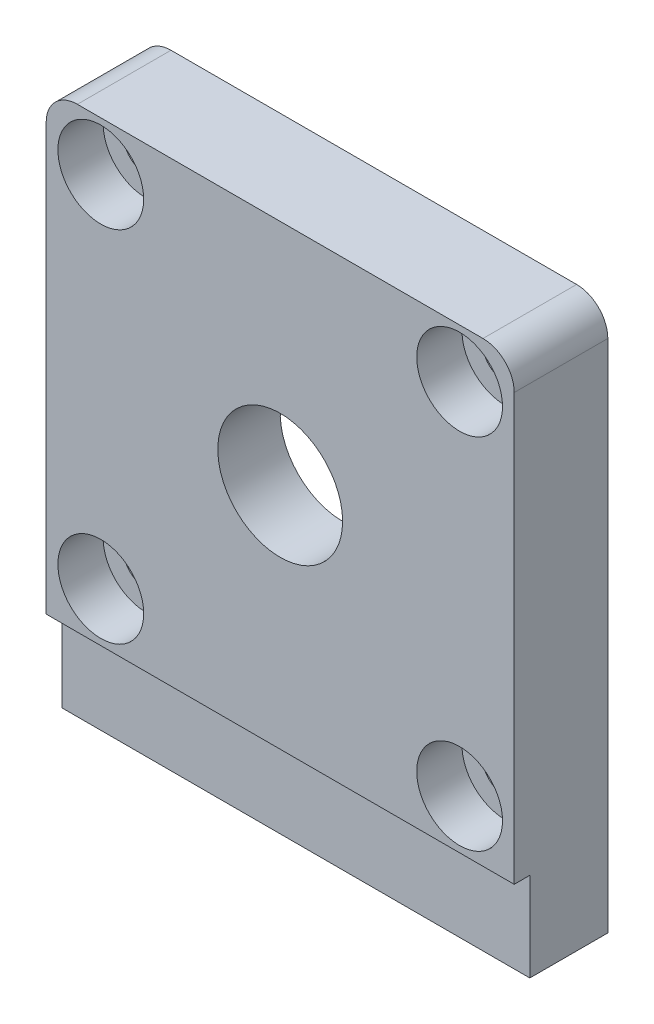
ISO-10303-21;
HEADER;
FILE_DESCRIPTION(('STEP AP214'),'2;1');
FILE_NAME('part.step','',(''),(''),'','','');
FILE_SCHEMA(('AUTOMOTIVE_DESIGN { 1 0 10303 214 1 1 1 1 }'));
ENDSEC;
DATA;
#1=APPLICATION_CONTEXT('core data for automotive mechanical design processes');
#2=APPLICATION_PROTOCOL_DEFINITION('international standard','automotive_design',2000,#1);
#3=PRODUCT_CONTEXT('',#1,'mechanical');
#4=PRODUCT('Part','Part','',(#3));
#5=PRODUCT_RELATED_PRODUCT_CATEGORY('part','',(#4));
#6=PRODUCT_DEFINITION_FORMATION('','',#4);
#7=PRODUCT_DEFINITION_CONTEXT('part definition',#1,'design');
#8=PRODUCT_DEFINITION('design','',#6,#7);
#9=PRODUCT_DEFINITION_SHAPE('','',#8);
#10=(LENGTH_UNIT() NAMED_UNIT(*) SI_UNIT(.MILLI.,.METRE.));
#11=(NAMED_UNIT(*) PLANE_ANGLE_UNIT() SI_UNIT($,.RADIAN.));
#12=(NAMED_UNIT(*) SI_UNIT($,.STERADIAN.) SOLID_ANGLE_UNIT());
#13=UNCERTAINTY_MEASURE_WITH_UNIT(LENGTH_MEASURE(1.E-05),#10,'distance_accuracy_value','');
#14=(GEOMETRIC_REPRESENTATION_CONTEXT(3) GLOBAL_UNCERTAINTY_ASSIGNED_CONTEXT((#13)) GLOBAL_UNIT_ASSIGNED_CONTEXT((#10,
#11,#12)) REPRESENTATION_CONTEXT('',''));
#15=CARTESIAN_POINT('',(0.,0.,0.));
#16=DIRECTION('',(0.,0.,1.));
#17=DIRECTION('',(1.,0.,0.));
#18=AXIS2_PLACEMENT_3D('',#15,#16,#17);
#19=CARTESIAN_POINT('',(0.,17.35,-16.3137084989848));
#20=DIRECTION('',(0.,0.,1.));
#21=DIRECTION('',(1.,0.,0.));
#22=AXIS2_PLACEMENT_3D('',#19,#20,#21);
#23=CYLINDRICAL_SURFACE('',#22,4.);
#24=CARTESIAN_POINT('',(0.,17.35,1.));
#25=DIRECTION('',(0.,0.,1.));
#26=DIRECTION('',(1.,0.,0.));
#27=AXIS2_PLACEMENT_3D('',#24,#25,#26);
#28=CIRCLE('',#27,4.);
#29=CARTESIAN_POINT('',(4.,17.35,1.));
#30=VERTEX_POINT('',#29);
#31=EDGE_CURVE('E164',#30,#30,#28,.T.);
#32=ORIENTED_EDGE('',*,*,#31,.T.);
#33=EDGE_LOOP('',(#32));
#34=FACE_BOUND('',#33,.T.);
#35=CARTESIAN_POINT('',(0.,17.35,-3.));
#36=DIRECTION('',(0.,0.,-1.));
#37=DIRECTION('',(0.,1.,0.));
#38=AXIS2_PLACEMENT_3D('',#35,#36,#37);
#39=CIRCLE('',#38,4.);
#40=CARTESIAN_POINT('',(0.,21.35,-3.));
#41=VERTEX_POINT('',#40);
#42=EDGE_CURVE('E162',#41,#41,#39,.F.);
#43=ORIENTED_EDGE('',*,*,#42,.F.);
#44=EDGE_LOOP('',(#43));
#45=FACE_BOUND('',#44,.T.);
#46=ADVANCED_FACE('F44',(#34,#45),#23,.F.);
#47=CARTESIAN_POINT('',(50.5105618091294,2.7,0.));
#48=DIRECTION('',(0.,-1.,0.));
#49=DIRECTION('',(0.,0.,-1.));
#50=AXIS2_PLACEMENT_3D('',#47,#48,#49);
#51=PLANE('',#50);
#52=DIRECTION('',(0.,0.,-1.));
#53=VECTOR('',#52,1.);
#54=CARTESIAN_POINT('',(15.,2.7,0.));
#55=LINE('',#54,#53);
#56=CARTESIAN_POINT('',(15.,2.7,1.));
#57=VERTEX_POINT('',#56);
#58=CARTESIAN_POINT('',(15.,2.7,0.));
#59=VERTEX_POINT('',#58);
#60=EDGE_CURVE('E117',#57,#59,#55,.T.);
#61=ORIENTED_EDGE('',*,*,#60,.F.);
#62=DIRECTION('',(-1.,0.,0.));
#63=VECTOR('',#62,1.);
#64=CARTESIAN_POINT('',(50.5105618091294,2.7,1.));
#65=LINE('',#64,#63);
#66=CARTESIAN_POINT('',(-15.,2.7,1.));
#67=VERTEX_POINT('',#66);
#68=EDGE_CURVE('E111',#57,#67,#65,.T.);
#69=ORIENTED_EDGE('',*,*,#68,.T.);
#70=DIRECTION('',(0.,0.,1.));
#71=VECTOR('',#70,1.);
#72=CARTESIAN_POINT('',(-15.,2.7,0.));
#73=LINE('',#72,#71);
#74=CARTESIAN_POINT('',(-15.,2.7,0.));
#75=VERTEX_POINT('',#74);
#76=EDGE_CURVE('E116',#75,#67,#73,.T.);
#77=ORIENTED_EDGE('',*,*,#76,.F.);
#78=DIRECTION('',(-1.,0.,0.));
#79=VECTOR('',#78,1.);
#80=CARTESIAN_POINT('',(50.5105618091294,2.7,0.));
#81=LINE('',#80,#79);
#82=EDGE_CURVE('E150',#59,#75,#81,.T.);
#83=ORIENTED_EDGE('',*,*,#82,.F.);
#84=EDGE_LOOP('',(#61,#69,#77,#83));
#85=FACE_BOUND('',#84,.T.);
#86=ADVANCED_FACE('F113',(#85),#51,.T.);
#87=CARTESIAN_POINT('',(50.5105618091294,2.7,0.));
#88=DIRECTION('',(0.,0.,1.));
#89=DIRECTION('',(1.,0.,0.));
#90=AXIS2_PLACEMENT_3D('',#87,#88,#89);
#91=PLANE('',#90);
#92=DIRECTION('',(0.,-1.,0.));
#93=VECTOR('',#92,1.);
#94=CARTESIAN_POINT('',(15.,2.7,0.));
#95=LINE('',#94,#93);
#96=CARTESIAN_POINT('',(15.,-3.,0.));
#97=VERTEX_POINT('',#96);
#98=EDGE_CURVE('E200',#59,#97,#95,.T.);
#99=ORIENTED_EDGE('',*,*,#98,.F.);
#100=ORIENTED_EDGE('',*,*,#82,.T.);
#101=DIRECTION('',(0.,1.,0.));
#102=VECTOR('',#101,1.);
#103=CARTESIAN_POINT('',(-15.,2.7,0.));
#104=LINE('',#103,#102);
#105=CARTESIAN_POINT('',(-15.,-3.,0.));
#106=VERTEX_POINT('',#105);
#107=EDGE_CURVE('E125',#106,#75,#104,.T.);
#108=ORIENTED_EDGE('',*,*,#107,.F.);
#109=DIRECTION('',(-1.,0.,0.));
#110=VECTOR('',#109,1.);
#111=CARTESIAN_POINT('',(50.5105618091294,-3.,0.));
#112=LINE('',#111,#110);
#113=EDGE_CURVE('E151',#97,#106,#112,.T.);
#114=ORIENTED_EDGE('',*,*,#113,.F.);
#115=EDGE_LOOP('',(#99,#100,#108,#114));
#116=FACE_BOUND('',#115,.T.);
#117=ADVANCED_FACE('F198',(#116),#91,.T.);
#118=CARTESIAN_POINT('',(50.5105618091294,-3.,-5.));
#119=DIRECTION('',(0.,-1.,0.));
#120=DIRECTION('',(0.,0.,-1.));
#121=AXIS2_PLACEMENT_3D('',#118,#119,#120);
#122=PLANE('',#121);
#123=DIRECTION('',(0.,0.,-1.));
#124=VECTOR('',#123,1.);
#125=CARTESIAN_POINT('',(15.,-3.,-5.));
#126=LINE('',#125,#124);
#127=CARTESIAN_POINT('',(15.,-3.,-5.));
#128=VERTEX_POINT('',#127);
#129=EDGE_CURVE('E190',#97,#128,#126,.T.);
#130=ORIENTED_EDGE('',*,*,#129,.F.);
#131=ORIENTED_EDGE('',*,*,#113,.T.);
#132=DIRECTION('',(0.,0.,1.));
#133=VECTOR('',#132,1.);
#134=CARTESIAN_POINT('',(-15.,-3.,-5.));
#135=LINE('',#134,#133);
#136=CARTESIAN_POINT('',(-15.,-3.,-5.));
#137=VERTEX_POINT('',#136);
#138=EDGE_CURVE('E143',#137,#106,#135,.T.);
#139=ORIENTED_EDGE('',*,*,#138,.F.);
#140=DIRECTION('',(-1.,0.,0.));
#141=VECTOR('',#140,1.);
#142=CARTESIAN_POINT('',(50.5105618091294,-3.,-5.));
#143=LINE('',#142,#141);
#144=EDGE_CURVE('E154',#128,#137,#143,.T.);
#145=ORIENTED_EDGE('',*,*,#144,.F.);
#146=EDGE_LOOP('',(#130,#131,#139,#145));
#147=FACE_BOUND('',#146,.T.);
#148=ADVANCED_FACE('F193',(#147),#122,.T.);
#149=CARTESIAN_POINT('',(50.5105618091294,32.,-5.));
#150=DIRECTION('',(0.,0.,-1.));
#151=DIRECTION('',(0.,1.,0.));
#152=AXIS2_PLACEMENT_3D('',#149,#150,#151);
#153=PLANE('',#152);
#154=CARTESIAN_POINT('',(0.,17.35,-5.));
#155=DIRECTION('',(0.,0.,-1.));
#156=DIRECTION('',(0.,1.,0.));
#157=AXIS2_PLACEMENT_3D('',#154,#155,#156);
#158=CIRCLE('',#157,11.);
#159=CARTESIAN_POINT('',(0.,28.35,-5.));
#160=VERTEX_POINT('',#159);
#161=EDGE_CURVE('E248',#160,#160,#158,.T.);
#162=ORIENTED_EDGE('',*,*,#161,.F.);
#163=EDGE_LOOP('',(#162));
#164=FACE_BOUND('',#163,.T.);
#165=CARTESIAN_POINT('',(-11.5,28.85,-5.));
#166=DIRECTION('',(0.,0.,-1.));
#167=DIRECTION('',(0.,1.,0.));
#168=AXIS2_PLACEMENT_3D('',#165,#166,#167);
#169=CIRCLE('',#168,1.45);
#170=CARTESIAN_POINT('',(-11.5,30.3,-5.));
#171=VERTEX_POINT('',#170);
#172=EDGE_CURVE('E236',#171,#171,#169,.F.);
#173=ORIENTED_EDGE('',*,*,#172,.T.);
#174=EDGE_LOOP('',(#173));
#175=FACE_BOUND('',#174,.T.);
#176=CARTESIAN_POINT('',(11.5,28.85,-5.));
#177=DIRECTION('',(0.,0.,-1.));
#178=DIRECTION('',(0.,1.,0.));
#179=AXIS2_PLACEMENT_3D('',#176,#177,#178);
#180=CIRCLE('',#179,1.45);
#181=CARTESIAN_POINT('',(11.5,30.3,-5.));
#182=VERTEX_POINT('',#181);
#183=EDGE_CURVE('E221',#182,#182,#180,.F.);
#184=ORIENTED_EDGE('',*,*,#183,.T.);
#185=EDGE_LOOP('',(#184));
#186=FACE_BOUND('',#185,.T.);
#187=CARTESIAN_POINT('',(11.5,5.85,-5.));
#188=DIRECTION('',(0.,0.,-1.));
#189=DIRECTION('',(0.,1.,0.));
#190=AXIS2_PLACEMENT_3D('',#187,#188,#189);
#191=CIRCLE('',#190,1.45);
#192=CARTESIAN_POINT('',(11.5,7.3,-5.));
#193=VERTEX_POINT('',#192);
#194=EDGE_CURVE('E214',#193,#193,#191,.F.);
#195=ORIENTED_EDGE('',*,*,#194,.T.);
#196=EDGE_LOOP('',(#195));
#197=FACE_BOUND('',#196,.T.);
#198=CARTESIAN_POINT('',(-11.5,5.85,-5.));
#199=DIRECTION('',(0.,0.,-1.));
#200=DIRECTION('',(0.,1.,0.));
#201=AXIS2_PLACEMENT_3D('',#198,#199,#200);
#202=CIRCLE('',#201,1.45);
#203=CARTESIAN_POINT('',(-11.5,7.3,-5.));
#204=VERTEX_POINT('',#203);
#205=EDGE_CURVE('E205',#204,#204,#202,.F.);
#206=ORIENTED_EDGE('',*,*,#205,.T.);
#207=EDGE_LOOP('',(#206));
#208=FACE_BOUND('',#207,.T.);
#209=DIRECTION('',(-1.,0.,0.));
#210=VECTOR('',#209,1.);
#211=CARTESIAN_POINT('',(50.5105618091294,32.,-5.));
#212=LINE('',#211,#210);
#213=CARTESIAN_POINT('',(13.,32.,-5.));
#214=VERTEX_POINT('',#213);
#215=CARTESIAN_POINT('',(-13.,32.,-5.));
#216=VERTEX_POINT('',#215);
#217=EDGE_CURVE('E157',#214,#216,#212,.T.);
#218=ORIENTED_EDGE('',*,*,#217,.F.);
#219=CARTESIAN_POINT('',(13.,30.,-5.));
#220=DIRECTION('',(0.,0.,-1.));
#221=DIRECTION('',(0.,1.,0.));
#222=AXIS2_PLACEMENT_3D('',#219,#220,#221);
#223=CIRCLE('',#222,2.);
#224=CARTESIAN_POINT('',(15.,30.,-5.));
#225=VERTEX_POINT('',#224);
#226=EDGE_CURVE('E52',#214,#225,#223,.T.);
#227=ORIENTED_EDGE('',*,*,#226,.T.);
#228=DIRECTION('',(0.,1.,0.));
#229=VECTOR('',#228,1.);
#230=CARTESIAN_POINT('',(15.,32.,-5.));
#231=LINE('',#230,#229);
#232=EDGE_CURVE('E148',#128,#225,#231,.T.);
#233=ORIENTED_EDGE('',*,*,#232,.F.);
#234=ORIENTED_EDGE('',*,*,#144,.T.);
#235=DIRECTION('',(0.,-1.,0.));
#236=VECTOR('',#235,1.);
#237=CARTESIAN_POINT('',(-15.,32.,-5.));
#238=LINE('',#237,#236);
#239=CARTESIAN_POINT('',(-15.,30.,-5.));
#240=VERTEX_POINT('',#239);
#241=EDGE_CURVE('E131',#240,#137,#238,.T.);
#242=ORIENTED_EDGE('',*,*,#241,.F.);
#243=CARTESIAN_POINT('',(-13.,30.,-5.));
#244=DIRECTION('',(0.,0.,-1.));
#245=DIRECTION('',(0.,1.,0.));
#246=AXIS2_PLACEMENT_3D('',#243,#244,#245);
#247=CIRCLE('',#246,2.);
#248=EDGE_CURVE('E58',#240,#216,#247,.T.);
#249=ORIENTED_EDGE('',*,*,#248,.T.);
#250=EDGE_LOOP('',(#218,#227,#233,#234,#242,#249));
#251=FACE_BOUND('',#250,.T.);
#252=ADVANCED_FACE('F177',(#164,#175,#186,#197,#208,#251),#153,.T.);
#253=CARTESIAN_POINT('',(50.5105618091294,32.,1.));
#254=DIRECTION('',(0.,1.,0.));
#255=DIRECTION('',(0.,0.,1.));
#256=AXIS2_PLACEMENT_3D('',#253,#254,#255);
#257=PLANE('',#256);
#258=DIRECTION('',(-1.,0.,0.));
#259=VECTOR('',#258,1.);
#260=CARTESIAN_POINT('',(50.5105618091294,32.,1.));
#261=LINE('',#260,#259);
#262=CARTESIAN_POINT('',(13.,32.,1.));
#263=VERTEX_POINT('',#262);
#264=CARTESIAN_POINT('',(-13.,32.,1.));
#265=VERTEX_POINT('',#264);
#266=EDGE_CURVE('E122',#263,#265,#261,.T.);
#267=ORIENTED_EDGE('',*,*,#266,.F.);
#268=DIRECTION('',(0.,0.,1.));
#269=VECTOR('',#268,1.);
#270=CARTESIAN_POINT('',(13.,32.,-5.));
#271=LINE('',#270,#269);
#272=EDGE_CURVE('E172',#263,#214,#271,.F.);
#273=ORIENTED_EDGE('',*,*,#272,.T.);
#274=ORIENTED_EDGE('',*,*,#217,.T.);
#275=DIRECTION('',(0.,0.,-1.));
#276=VECTOR('',#275,1.);
#277=CARTESIAN_POINT('',(-13.,32.,1.));
#278=LINE('',#277,#276);
#279=EDGE_CURVE('E175',#216,#265,#278,.F.);
#280=ORIENTED_EDGE('',*,*,#279,.T.);
#281=EDGE_LOOP('',(#267,#273,#274,#280));
#282=FACE_BOUND('',#281,.T.);
#283=ADVANCED_FACE('F194',(#282),#257,.T.);
#284=CARTESIAN_POINT('',(50.5105618091294,2.7,1.));
#285=DIRECTION('',(0.,0.,1.));
#286=DIRECTION('',(1.,0.,0.));
#287=AXIS2_PLACEMENT_3D('',#284,#285,#286);
#288=PLANE('',#287);
#289=ORIENTED_EDGE('',*,*,#31,.F.);
#290=EDGE_LOOP('',(#289));
#291=FACE_BOUND('',#290,.T.);
#292=CARTESIAN_POINT('',(-11.5,28.85,1.));
#293=DIRECTION('',(0.,0.,1.));
#294=DIRECTION('',(1.,0.,0.));
#295=AXIS2_PLACEMENT_3D('',#292,#293,#294);
#296=CIRCLE('',#295,2.75);
#297=CARTESIAN_POINT('',(-8.75,28.85,1.));
#298=VERTEX_POINT('',#297);
#299=EDGE_CURVE('E239',#298,#298,#296,.T.);
#300=ORIENTED_EDGE('',*,*,#299,.F.);
#301=EDGE_LOOP('',(#300));
#302=FACE_BOUND('',#301,.T.);
#303=CARTESIAN_POINT('',(11.5,28.85,1.));
#304=DIRECTION('',(0.,0.,1.));
#305=DIRECTION('',(1.,0.,0.));
#306=AXIS2_PLACEMENT_3D('',#303,#304,#305);
#307=CIRCLE('',#306,2.75);
#308=CARTESIAN_POINT('',(14.25,28.85,1.));
#309=VERTEX_POINT('',#308);
#310=EDGE_CURVE('E226',#309,#309,#307,.T.);
#311=ORIENTED_EDGE('',*,*,#310,.F.);
#312=EDGE_LOOP('',(#311));
#313=FACE_BOUND('',#312,.T.);
#314=CARTESIAN_POINT('',(11.5,5.85,1.));
#315=DIRECTION('',(0.,0.,1.));
#316=DIRECTION('',(1.,0.,0.));
#317=AXIS2_PLACEMENT_3D('',#314,#315,#316);
#318=CIRCLE('',#317,2.75);
#319=CARTESIAN_POINT('',(14.25,5.85,1.));
#320=VERTEX_POINT('',#319);
#321=EDGE_CURVE('E216',#320,#320,#318,.T.);
#322=ORIENTED_EDGE('',*,*,#321,.F.);
#323=EDGE_LOOP('',(#322));
#324=FACE_BOUND('',#323,.T.);
#325=CARTESIAN_POINT('',(-11.5,5.85,1.));
#326=DIRECTION('',(0.,0.,1.));
#327=DIRECTION('',(1.,0.,0.));
#328=AXIS2_PLACEMENT_3D('',#325,#326,#327);
#329=CIRCLE('',#328,2.75);
#330=CARTESIAN_POINT('',(-8.75,5.85,1.));
#331=VERTEX_POINT('',#330);
#332=EDGE_CURVE('E207',#331,#331,#329,.T.);
#333=ORIENTED_EDGE('',*,*,#332,.F.);
#334=EDGE_LOOP('',(#333));
#335=FACE_BOUND('',#334,.T.);
#336=DIRECTION('',(0.,-1.,0.));
#337=VECTOR('',#336,1.);
#338=CARTESIAN_POINT('',(15.,2.7,1.));
#339=LINE('',#338,#337);
#340=CARTESIAN_POINT('',(15.,30.,1.));
#341=VERTEX_POINT('',#340);
#342=EDGE_CURVE('E156',#341,#57,#339,.T.);
#343=ORIENTED_EDGE('',*,*,#342,.F.);
#344=CARTESIAN_POINT('',(13.,30.,1.));
#345=DIRECTION('',(0.,0.,1.));
#346=DIRECTION('',(1.,0.,0.));
#347=AXIS2_PLACEMENT_3D('',#344,#345,#346);
#348=CIRCLE('',#347,2.);
#349=EDGE_CURVE('E167',#341,#263,#348,.T.);
#350=ORIENTED_EDGE('',*,*,#349,.T.);
#351=ORIENTED_EDGE('',*,*,#266,.T.);
#352=CARTESIAN_POINT('',(-13.,30.,1.));
#353=DIRECTION('',(0.,0.,1.));
#354=DIRECTION('',(1.,0.,0.));
#355=AXIS2_PLACEMENT_3D('',#352,#353,#354);
#356=CIRCLE('',#355,2.);
#357=CARTESIAN_POINT('',(-15.,30.,1.));
#358=VERTEX_POINT('',#357);
#359=EDGE_CURVE('E126',#265,#358,#356,.T.);
#360=ORIENTED_EDGE('',*,*,#359,.T.);
#361=DIRECTION('',(0.,1.,0.));
#362=VECTOR('',#361,1.);
#363=CARTESIAN_POINT('',(-15.,2.7,1.));
#364=LINE('',#363,#362);
#365=EDGE_CURVE('E123',#67,#358,#364,.T.);
#366=ORIENTED_EDGE('',*,*,#365,.F.);
#367=ORIENTED_EDGE('',*,*,#68,.F.);
#368=EDGE_LOOP('',(#343,#350,#351,#360,#366,#367));
#369=FACE_BOUND('',#368,.T.);
#370=ADVANCED_FACE('F127',(#291,#302,#313,#324,#335,#369),#288,.T.);
#371=CARTESIAN_POINT('',(-15.,0.,0.));
#372=DIRECTION('',(-1.,0.,0.));
#373=DIRECTION('',(0.,0.,1.));
#374=AXIS2_PLACEMENT_3D('',#371,#372,#373);
#375=PLANE('',#374);
#376=ORIENTED_EDGE('',*,*,#365,.T.);
#377=DIRECTION('',(0.,0.,-1.));
#378=VECTOR('',#377,1.);
#379=CARTESIAN_POINT('',(-15.,30.,0.));
#380=LINE('',#379,#378);
#381=EDGE_CURVE('E11',#358,#240,#380,.T.);
#382=ORIENTED_EDGE('',*,*,#381,.T.);
#383=ORIENTED_EDGE('',*,*,#241,.T.);
#384=ORIENTED_EDGE('',*,*,#138,.T.);
#385=ORIENTED_EDGE('',*,*,#107,.T.);
#386=ORIENTED_EDGE('',*,*,#76,.T.);
#387=EDGE_LOOP('',(#376,#382,#383,#384,#385,#386));
#388=FACE_BOUND('',#387,.T.);
#389=ADVANCED_FACE('F134',(#388),#375,.T.);
#390=CARTESIAN_POINT('',(15.,-3.,138.));
#391=DIRECTION('',(-1.,0.,0.));
#392=DIRECTION('',(0.,0.,1.));
#393=AXIS2_PLACEMENT_3D('',#390,#391,#392);
#394=PLANE('',#393);
#395=ORIENTED_EDGE('',*,*,#232,.T.);
#396=DIRECTION('',(0.,0.,1.));
#397=VECTOR('',#396,1.);
#398=CARTESIAN_POINT('',(15.,30.,1.));
#399=LINE('',#398,#397);
#400=EDGE_CURVE('E163',#225,#341,#399,.T.);
#401=ORIENTED_EDGE('',*,*,#400,.T.);
#402=ORIENTED_EDGE('',*,*,#342,.T.);
#403=ORIENTED_EDGE('',*,*,#60,.T.);
#404=ORIENTED_EDGE('',*,*,#98,.T.);
#405=ORIENTED_EDGE('',*,*,#129,.T.);
#406=EDGE_LOOP('',(#395,#401,#402,#403,#404,#405));
#407=FACE_BOUND('',#406,.T.);
#408=ADVANCED_FACE('F184',(#407),#394,.F.);
#409=CARTESIAN_POINT('',(-11.5,5.85,1.));
#410=DIRECTION('',(0.,0.,1.));
#411=DIRECTION('',(1.,0.,0.));
#412=AXIS2_PLACEMENT_3D('',#409,#410,#411);
#413=CYLINDRICAL_SURFACE('',#412,1.45);
#414=ORIENTED_EDGE('',*,*,#205,.F.);
#415=EDGE_LOOP('',(#414));
#416=FACE_BOUND('',#415,.T.);
#417=CARTESIAN_POINT('',(-11.5,5.85,-1.9));
#418=DIRECTION('',(0.,0.,1.));
#419=DIRECTION('',(1.,0.,0.));
#420=AXIS2_PLACEMENT_3D('',#417,#418,#419);
#421=CIRCLE('',#420,1.45);
#422=CARTESIAN_POINT('',(-10.05,5.85,-1.9));
#423=VERTEX_POINT('',#422);
#424=EDGE_CURVE('E136',#423,#423,#421,.T.);
#425=ORIENTED_EDGE('',*,*,#424,.T.);
#426=EDGE_LOOP('',(#425));
#427=FACE_BOUND('',#426,.T.);
#428=ADVANCED_FACE('F273',(#416,#427),#413,.F.);
#429=CARTESIAN_POINT('',(-10.05,5.85,-1.9));
#430=DIRECTION('',(0.,0.,-1.));
#431=DIRECTION('',(-1.,0.,0.));
#432=AXIS2_PLACEMENT_3D('',#429,#430,#431);
#433=PLANE('',#432);
#434=ORIENTED_EDGE('',*,*,#424,.F.);
#435=EDGE_LOOP('',(#434));
#436=FACE_BOUND('',#435,.T.);
#437=CARTESIAN_POINT('',(-11.5,5.85,-1.9));
#438=DIRECTION('',(0.,0.,1.));
#439=DIRECTION('',(1.,0.,0.));
#440=AXIS2_PLACEMENT_3D('',#437,#438,#439);
#441=CIRCLE('',#440,2.75);
#442=CARTESIAN_POINT('',(-8.75,5.85,-1.9));
#443=VERTEX_POINT('',#442);
#444=EDGE_CURVE('E137',#443,#443,#441,.T.);
#445=ORIENTED_EDGE('',*,*,#444,.T.);
#446=EDGE_LOOP('',(#445));
#447=FACE_BOUND('',#446,.T.);
#448=ADVANCED_FACE('F280',(#436,#447),#433,.F.);
#449=CARTESIAN_POINT('',(-11.5,5.85,1.));
#450=DIRECTION('',(0.,0.,1.));
#451=DIRECTION('',(1.,0.,0.));
#452=AXIS2_PLACEMENT_3D('',#449,#450,#451);
#453=CYLINDRICAL_SURFACE('',#452,2.75);
#454=ORIENTED_EDGE('',*,*,#444,.F.);
#455=EDGE_LOOP('',(#454));
#456=FACE_BOUND('',#455,.T.);
#457=ORIENTED_EDGE('',*,*,#332,.T.);
#458=EDGE_LOOP('',(#457));
#459=FACE_BOUND('',#458,.T.);
#460=ADVANCED_FACE('F283',(#456,#459),#453,.F.);
#461=CARTESIAN_POINT('',(11.5,5.85,1.));
#462=DIRECTION('',(0.,0.,1.));
#463=DIRECTION('',(1.,0.,0.));
#464=AXIS2_PLACEMENT_3D('',#461,#462,#463);
#465=CYLINDRICAL_SURFACE('',#464,1.45);
#466=ORIENTED_EDGE('',*,*,#194,.F.);
#467=EDGE_LOOP('',(#466));
#468=FACE_BOUND('',#467,.T.);
#469=CARTESIAN_POINT('',(11.5,5.85,-1.9));
#470=DIRECTION('',(0.,0.,1.));
#471=DIRECTION('',(1.,0.,0.));
#472=AXIS2_PLACEMENT_3D('',#469,#470,#471);
#473=CIRCLE('',#472,1.45);
#474=CARTESIAN_POINT('',(12.95,5.85,-1.9));
#475=VERTEX_POINT('',#474);
#476=EDGE_CURVE('E213',#475,#475,#473,.T.);
#477=ORIENTED_EDGE('',*,*,#476,.T.);
#478=EDGE_LOOP('',(#477));
#479=FACE_BOUND('',#478,.T.);
#480=ADVANCED_FACE('F288',(#468,#479),#465,.F.);
#481=CARTESIAN_POINT('',(12.95,5.85,-1.9));
#482=DIRECTION('',(0.,0.,-1.));
#483=DIRECTION('',(-1.,0.,0.));
#484=AXIS2_PLACEMENT_3D('',#481,#482,#483);
#485=PLANE('',#484);
#486=ORIENTED_EDGE('',*,*,#476,.F.);
#487=EDGE_LOOP('',(#486));
#488=FACE_BOUND('',#487,.T.);
#489=CARTESIAN_POINT('',(11.5,5.85,-1.9));
#490=DIRECTION('',(0.,0.,1.));
#491=DIRECTION('',(1.,0.,0.));
#492=AXIS2_PLACEMENT_3D('',#489,#490,#491);
#493=CIRCLE('',#492,2.75);
#494=CARTESIAN_POINT('',(14.25,5.85,-1.9));
#495=VERTEX_POINT('',#494);
#496=EDGE_CURVE('E206',#495,#495,#493,.T.);
#497=ORIENTED_EDGE('',*,*,#496,.T.);
#498=EDGE_LOOP('',(#497));
#499=FACE_BOUND('',#498,.T.);
#500=ADVANCED_FACE('F341',(#488,#499),#485,.F.);
#501=CARTESIAN_POINT('',(11.5,5.85,1.));
#502=DIRECTION('',(0.,0.,1.));
#503=DIRECTION('',(1.,0.,0.));
#504=AXIS2_PLACEMENT_3D('',#501,#502,#503);
#505=CYLINDRICAL_SURFACE('',#504,2.75);
#506=ORIENTED_EDGE('',*,*,#496,.F.);
#507=EDGE_LOOP('',(#506));
#508=FACE_BOUND('',#507,.T.);
#509=ORIENTED_EDGE('',*,*,#321,.T.);
#510=EDGE_LOOP('',(#509));
#511=FACE_BOUND('',#510,.T.);
#512=ADVANCED_FACE('F331',(#508,#511),#505,.F.);
#513=CARTESIAN_POINT('',(11.5,28.85,1.));
#514=DIRECTION('',(0.,0.,1.));
#515=DIRECTION('',(1.,0.,0.));
#516=AXIS2_PLACEMENT_3D('',#513,#514,#515);
#517=CYLINDRICAL_SURFACE('',#516,1.45);
#518=ORIENTED_EDGE('',*,*,#183,.F.);
#519=EDGE_LOOP('',(#518));
#520=FACE_BOUND('',#519,.T.);
#521=CARTESIAN_POINT('',(11.5,28.85,-1.9));
#522=DIRECTION('',(0.,0.,1.));
#523=DIRECTION('',(1.,0.,0.));
#524=AXIS2_PLACEMENT_3D('',#521,#522,#523);
#525=CIRCLE('',#524,1.45);
#526=CARTESIAN_POINT('',(12.95,28.85,-1.9));
#527=VERTEX_POINT('',#526);
#528=EDGE_CURVE('E227',#527,#527,#525,.T.);
#529=ORIENTED_EDGE('',*,*,#528,.T.);
#530=EDGE_LOOP('',(#529));
#531=FACE_BOUND('',#530,.T.);
#532=ADVANCED_FACE('F330',(#520,#531),#517,.F.);
#533=CARTESIAN_POINT('',(12.95,28.85,-1.9));
#534=DIRECTION('',(0.,0.,-1.));
#535=DIRECTION('',(-1.,0.,0.));
#536=AXIS2_PLACEMENT_3D('',#533,#534,#535);
#537=PLANE('',#536);
#538=ORIENTED_EDGE('',*,*,#528,.F.);
#539=EDGE_LOOP('',(#538));
#540=FACE_BOUND('',#539,.T.);
#541=CARTESIAN_POINT('',(11.5,28.85,-1.9));
#542=DIRECTION('',(0.,0.,1.));
#543=DIRECTION('',(1.,0.,0.));
#544=AXIS2_PLACEMENT_3D('',#541,#542,#543);
#545=CIRCLE('',#544,2.75);
#546=CARTESIAN_POINT('',(14.25,28.85,-1.9));
#547=VERTEX_POINT('',#546);
#548=EDGE_CURVE('E218',#547,#547,#545,.T.);
#549=ORIENTED_EDGE('',*,*,#548,.T.);
#550=EDGE_LOOP('',(#549));
#551=FACE_BOUND('',#550,.T.);
#552=ADVANCED_FACE('F335',(#540,#551),#537,.F.);
#553=CARTESIAN_POINT('',(11.5,28.85,1.));
#554=DIRECTION('',(0.,0.,1.));
#555=DIRECTION('',(1.,0.,0.));
#556=AXIS2_PLACEMENT_3D('',#553,#554,#555);
#557=CYLINDRICAL_SURFACE('',#556,2.75);
#558=ORIENTED_EDGE('',*,*,#548,.F.);
#559=EDGE_LOOP('',(#558));
#560=FACE_BOUND('',#559,.T.);
#561=ORIENTED_EDGE('',*,*,#310,.T.);
#562=EDGE_LOOP('',(#561));
#563=FACE_BOUND('',#562,.T.);
#564=ADVANCED_FACE('F322',(#560,#563),#557,.F.);
#565=CARTESIAN_POINT('',(-11.5,28.85,1.));
#566=DIRECTION('',(0.,0.,1.));
#567=DIRECTION('',(1.,0.,0.));
#568=AXIS2_PLACEMENT_3D('',#565,#566,#567);
#569=CYLINDRICAL_SURFACE('',#568,1.45);
#570=ORIENTED_EDGE('',*,*,#172,.F.);
#571=EDGE_LOOP('',(#570));
#572=FACE_BOUND('',#571,.T.);
#573=CARTESIAN_POINT('',(-11.5,28.85,-1.9));
#574=DIRECTION('',(0.,0.,1.));
#575=DIRECTION('',(1.,0.,0.));
#576=AXIS2_PLACEMENT_3D('',#573,#574,#575);
#577=CIRCLE('',#576,1.45);
#578=CARTESIAN_POINT('',(-10.05,28.85,-1.9));
#579=VERTEX_POINT('',#578);
#580=EDGE_CURVE('E237',#579,#579,#577,.T.);
#581=ORIENTED_EDGE('',*,*,#580,.T.);
#582=EDGE_LOOP('',(#581));
#583=FACE_BOUND('',#582,.T.);
#584=ADVANCED_FACE('F320',(#572,#583),#569,.F.);
#585=CARTESIAN_POINT('',(-10.05,28.85,-1.9));
#586=DIRECTION('',(0.,0.,-1.));
#587=DIRECTION('',(-1.,0.,0.));
#588=AXIS2_PLACEMENT_3D('',#585,#586,#587);
#589=PLANE('',#588);
#590=ORIENTED_EDGE('',*,*,#580,.F.);
#591=EDGE_LOOP('',(#590));
#592=FACE_BOUND('',#591,.T.);
#593=CARTESIAN_POINT('',(-11.5,28.85,-1.9));
#594=DIRECTION('',(0.,0.,1.));
#595=DIRECTION('',(1.,0.,0.));
#596=AXIS2_PLACEMENT_3D('',#593,#594,#595);
#597=CIRCLE('',#596,2.75);
#598=CARTESIAN_POINT('',(-8.75,28.85,-1.9));
#599=VERTEX_POINT('',#598);
#600=EDGE_CURVE('E233',#599,#599,#597,.T.);
#601=ORIENTED_EDGE('',*,*,#600,.T.);
#602=EDGE_LOOP('',(#601));
#603=FACE_BOUND('',#602,.T.);
#604=ADVANCED_FACE('F318',(#592,#603),#589,.F.);
#605=CARTESIAN_POINT('',(-11.5,28.85,1.));
#606=DIRECTION('',(0.,0.,1.));
#607=DIRECTION('',(1.,0.,0.));
#608=AXIS2_PLACEMENT_3D('',#605,#606,#607);
#609=CYLINDRICAL_SURFACE('',#608,2.75);
#610=ORIENTED_EDGE('',*,*,#600,.F.);
#611=EDGE_LOOP('',(#610));
#612=FACE_BOUND('',#611,.T.);
#613=ORIENTED_EDGE('',*,*,#299,.T.);
#614=EDGE_LOOP('',(#613));
#615=FACE_BOUND('',#614,.T.);
#616=ADVANCED_FACE('F323',(#612,#615),#609,.F.);
#617=CARTESIAN_POINT('',(0.,17.35,-3.));
#618=DIRECTION('',(0.,0.,-1.));
#619=DIRECTION('',(0.,1.,0.));
#620=AXIS2_PLACEMENT_3D('',#617,#618,#619);
#621=PLANE('',#620);
#622=CARTESIAN_POINT('',(0.,17.35,-3.));
#623=DIRECTION('',(0.,0.,-1.));
#624=DIRECTION('',(0.,1.,0.));
#625=AXIS2_PLACEMENT_3D('',#622,#623,#624);
#626=CIRCLE('',#625,11.);
#627=CARTESIAN_POINT('',(0.,28.35,-3.));
#628=VERTEX_POINT('',#627);
#629=EDGE_CURVE('E168',#628,#628,#626,.T.);
#630=ORIENTED_EDGE('',*,*,#629,.T.);
#631=EDGE_LOOP('',(#630));
#632=FACE_BOUND('',#631,.T.);
#633=ORIENTED_EDGE('',*,*,#42,.T.);
#634=EDGE_LOOP('',(#633));
#635=FACE_BOUND('',#634,.T.);
#636=ADVANCED_FACE('F253',(#632,#635),#621,.T.);
#637=CARTESIAN_POINT('',(0.,17.35,-3.));
#638=DIRECTION('',(0.,0.,-1.));
#639=DIRECTION('',(0.,1.,0.));
#640=AXIS2_PLACEMENT_3D('',#637,#638,#639);
#641=CYLINDRICAL_SURFACE('',#640,11.);
#642=ORIENTED_EDGE('',*,*,#629,.F.);
#643=EDGE_LOOP('',(#642));
#644=FACE_BOUND('',#643,.T.);
#645=ORIENTED_EDGE('',*,*,#161,.T.);
#646=EDGE_LOOP('',(#645));
#647=FACE_BOUND('',#646,.T.);
#648=ADVANCED_FACE('F260',(#644,#647),#641,.F.);
#649=CARTESIAN_POINT('',(13.,30.,138.));
#650=DIRECTION('',(0.,0.,-1.));
#651=DIRECTION('',(-1.,0.,0.));
#652=AXIS2_PLACEMENT_3D('',#649,#650,#651);
#653=CYLINDRICAL_SURFACE('',#652,2.);
#654=ORIENTED_EDGE('',*,*,#226,.F.);
#655=ORIENTED_EDGE('',*,*,#272,.F.);
#656=ORIENTED_EDGE('',*,*,#349,.F.);
#657=ORIENTED_EDGE('',*,*,#400,.F.);
#658=EDGE_LOOP('',(#654,#655,#656,#657));
#659=FACE_BOUND('',#658,.T.);
#660=ADVANCED_FACE('F186',(#659),#653,.T.);
#661=CARTESIAN_POINT('',(-13.,30.,0.));
#662=DIRECTION('',(0.,0.,-1.));
#663=DIRECTION('',(-1.,0.,0.));
#664=AXIS2_PLACEMENT_3D('',#661,#662,#663);
#665=CYLINDRICAL_SURFACE('',#664,2.);
#666=ORIENTED_EDGE('',*,*,#359,.F.);
#667=ORIENTED_EDGE('',*,*,#279,.F.);
#668=ORIENTED_EDGE('',*,*,#248,.F.);
#669=ORIENTED_EDGE('',*,*,#381,.F.);
#670=EDGE_LOOP('',(#666,#667,#668,#669));
#671=FACE_BOUND('',#670,.T.);
#672=ADVANCED_FACE('F50',(#671),#665,.T.);
#673=CLOSED_SHELL('',(#46,#86,#117,#148,#252,#283,#370,#389,#408,#428,#448,#460,#480,#500,#512,
#532,#552,#564,#584,#604,#616,#636,#648,#660,#672));
#674=MANIFOLD_SOLID_BREP('B2',#673);
#675=ADVANCED_BREP_SHAPE_REPRESENTATION('',(#18,#674),#14);
#676=SHAPE_DEFINITION_REPRESENTATION(#9,#675);
ENDSEC;
END-ISO-10303-21;
